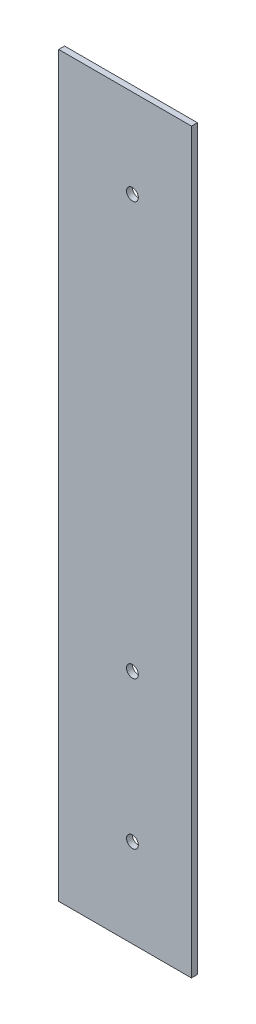
ISO-10303-21;
HEADER;
FILE_DESCRIPTION(('STEP AP214'),'2;1');
FILE_NAME('part.step','',(''),(''),'','','');
FILE_SCHEMA(('AUTOMOTIVE_DESIGN { 1 0 10303 214 1 1 1 1 }'));
ENDSEC;
DATA;
#1=APPLICATION_CONTEXT('core data for automotive mechanical design processes');
#2=APPLICATION_PROTOCOL_DEFINITION('international standard','automotive_design',2000,#1);
#3=PRODUCT_CONTEXT('',#1,'mechanical');
#4=PRODUCT('Part','Part','',(#3));
#5=PRODUCT_RELATED_PRODUCT_CATEGORY('part','',(#4));
#6=PRODUCT_DEFINITION_FORMATION('','',#4);
#7=PRODUCT_DEFINITION_CONTEXT('part definition',#1,'design');
#8=PRODUCT_DEFINITION('design','',#6,#7);
#9=PRODUCT_DEFINITION_SHAPE('','',#8);
#10=(LENGTH_UNIT() NAMED_UNIT(*) SI_UNIT(.MILLI.,.METRE.));
#11=(NAMED_UNIT(*) PLANE_ANGLE_UNIT() SI_UNIT($,.RADIAN.));
#12=(NAMED_UNIT(*) SI_UNIT($,.STERADIAN.) SOLID_ANGLE_UNIT());
#13=UNCERTAINTY_MEASURE_WITH_UNIT(LENGTH_MEASURE(1.E-05),#10,'distance_accuracy_value','');
#14=(GEOMETRIC_REPRESENTATION_CONTEXT(3) GLOBAL_UNCERTAINTY_ASSIGNED_CONTEXT((#13)) GLOBAL_UNIT_ASSIGNED_CONTEXT((#10,
#11,#12)) REPRESENTATION_CONTEXT('',''));
#15=CARTESIAN_POINT('',(0.,0.,0.));
#16=DIRECTION('',(0.,0.,1.));
#17=DIRECTION('',(1.,0.,0.));
#18=AXIS2_PLACEMENT_3D('',#15,#16,#17);
#19=CARTESIAN_POINT('',(22.5,99.9999999999999,2.));
#20=DIRECTION('',(-1.,0.,0.));
#21=DIRECTION('',(0.,-1.,0.));
#22=AXIS2_PLACEMENT_3D('',#19,#20,#21);
#23=PLANE('',#22);
#24=DIRECTION('',(0.,1.,0.));
#25=VECTOR('',#24,1.);
#26=CARTESIAN_POINT('',(22.5,99.9999999999999,0.));
#27=LINE('',#26,#25);
#28=CARTESIAN_POINT('',(22.5,-150.,0.));
#29=VERTEX_POINT('',#28);
#30=CARTESIAN_POINT('',(22.5,99.9999999999999,0.));
#31=VERTEX_POINT('',#30);
#32=EDGE_CURVE('E91',#29,#31,#27,.T.);
#33=ORIENTED_EDGE('',*,*,#32,.T.);
#34=DIRECTION('',(0.,0.,-1.));
#35=VECTOR('',#34,1.);
#36=CARTESIAN_POINT('',(22.5,99.9999999999999,2.));
#37=LINE('',#36,#35);
#38=CARTESIAN_POINT('',(22.5,99.9999999999999,2.));
#39=VERTEX_POINT('',#38);
#40=EDGE_CURVE('E11',#39,#31,#37,.T.);
#41=ORIENTED_EDGE('',*,*,#40,.F.);
#42=DIRECTION('',(0.,1.,0.));
#43=VECTOR('',#42,1.);
#44=CARTESIAN_POINT('',(22.5,99.9999999999999,2.));
#45=LINE('',#44,#43);
#46=CARTESIAN_POINT('',(22.5,-150.,2.));
#47=VERTEX_POINT('',#46);
#48=EDGE_CURVE('E85',#47,#39,#45,.T.);
#49=ORIENTED_EDGE('',*,*,#48,.F.);
#50=DIRECTION('',(0.,0.,1.));
#51=VECTOR('',#50,1.);
#52=CARTESIAN_POINT('',(22.5,-150.,2.));
#53=LINE('',#52,#51);
#54=EDGE_CURVE('E95',#29,#47,#53,.T.);
#55=ORIENTED_EDGE('',*,*,#54,.F.);
#56=EDGE_LOOP('',(#33,#41,#49,#55));
#57=FACE_BOUND('',#56,.T.);
#58=ADVANCED_FACE('F37',(#57),#23,.F.);
#59=CARTESIAN_POINT('',(-22.5,99.9999999999999,2.));
#60=DIRECTION('',(0.,-1.,0.));
#61=DIRECTION('',(0.,0.,-1.));
#62=AXIS2_PLACEMENT_3D('',#59,#60,#61);
#63=PLANE('',#62);
#64=DIRECTION('',(-1.,0.,0.));
#65=VECTOR('',#64,1.);
#66=CARTESIAN_POINT('',(-22.5,99.9999999999999,0.));
#67=LINE('',#66,#65);
#68=CARTESIAN_POINT('',(-22.5,99.9999999999999,0.));
#69=VERTEX_POINT('',#68);
#70=EDGE_CURVE('E64',#31,#69,#67,.T.);
#71=ORIENTED_EDGE('',*,*,#70,.T.);
#72=DIRECTION('',(0.,0.,-1.));
#73=VECTOR('',#72,1.);
#74=CARTESIAN_POINT('',(-22.5,99.9999999999999,2.));
#75=LINE('',#74,#73);
#76=CARTESIAN_POINT('',(-22.5,99.9999999999999,2.));
#77=VERTEX_POINT('',#76);
#78=EDGE_CURVE('E45',#77,#69,#75,.T.);
#79=ORIENTED_EDGE('',*,*,#78,.F.);
#80=DIRECTION('',(-1.,0.,0.));
#81=VECTOR('',#80,1.);
#82=CARTESIAN_POINT('',(-22.5,99.9999999999999,2.));
#83=LINE('',#82,#81);
#84=EDGE_CURVE('E53',#39,#77,#83,.T.);
#85=ORIENTED_EDGE('',*,*,#84,.F.);
#86=ORIENTED_EDGE('',*,*,#40,.T.);
#87=EDGE_LOOP('',(#71,#79,#85,#86));
#88=FACE_BOUND('',#87,.T.);
#89=ADVANCED_FACE('F125',(#88),#63,.F.);
#90=CARTESIAN_POINT('',(-22.5,99.9999999999999,2.));
#91=DIRECTION('',(1.,0.,0.));
#92=DIRECTION('',(0.,1.,0.));
#93=AXIS2_PLACEMENT_3D('',#90,#91,#92);
#94=PLANE('',#93);
#95=DIRECTION('',(0.,-1.,0.));
#96=VECTOR('',#95,1.);
#97=CARTESIAN_POINT('',(-22.5,99.9999999999999,0.));
#98=LINE('',#97,#96);
#99=CARTESIAN_POINT('',(-22.5,-150.,0.));
#100=VERTEX_POINT('',#99);
#101=EDGE_CURVE('E80',#69,#100,#98,.T.);
#102=ORIENTED_EDGE('',*,*,#101,.T.);
#103=DIRECTION('',(0.,0.,-1.));
#104=VECTOR('',#103,1.);
#105=CARTESIAN_POINT('',(-22.5,-150.,2.));
#106=LINE('',#105,#104);
#107=CARTESIAN_POINT('',(-22.5,-150.,2.));
#108=VERTEX_POINT('',#107);
#109=EDGE_CURVE('E84',#108,#100,#106,.T.);
#110=ORIENTED_EDGE('',*,*,#109,.F.);
#111=DIRECTION('',(0.,-1.,0.));
#112=VECTOR('',#111,1.);
#113=CARTESIAN_POINT('',(-22.5,99.9999999999999,2.));
#114=LINE('',#113,#112);
#115=EDGE_CURVE('E68',#77,#108,#114,.T.);
#116=ORIENTED_EDGE('',*,*,#115,.F.);
#117=ORIENTED_EDGE('',*,*,#78,.T.);
#118=EDGE_LOOP('',(#102,#110,#116,#117));
#119=FACE_BOUND('',#118,.T.);
#120=ADVANCED_FACE('F82',(#119),#94,.F.);
#121=CARTESIAN_POINT('',(0.,0.,2.));
#122=DIRECTION('',(0.,0.,1.));
#123=DIRECTION('',(1.,0.,0.));
#124=AXIS2_PLACEMENT_3D('',#121,#122,#123);
#125=PLANE('',#124);
#126=CARTESIAN_POINT('',(2.49999999999998,-120.,2.));
#127=DIRECTION('',(0.,0.,1.));
#128=DIRECTION('',(1.,0.,0.));
#129=AXIS2_PLACEMENT_3D('',#126,#127,#128);
#130=CIRCLE('',#129,2.);
#131=CARTESIAN_POINT('',(4.49999999999998,-120.,2.));
#132=VERTEX_POINT('',#131);
#133=EDGE_CURVE('E99',#132,#132,#130,.T.);
#134=ORIENTED_EDGE('',*,*,#133,.F.);
#135=EDGE_LOOP('',(#134));
#136=FACE_BOUND('',#135,.T.);
#137=CARTESIAN_POINT('',(2.49999999999998,70.,2.));
#138=DIRECTION('',(0.,0.,1.));
#139=DIRECTION('',(1.,0.,0.));
#140=AXIS2_PLACEMENT_3D('',#137,#138,#139);
#141=CIRCLE('',#140,2.);
#142=CARTESIAN_POINT('',(4.49999999999998,70.,2.));
#143=VERTEX_POINT('',#142);
#144=EDGE_CURVE('E112',#143,#143,#141,.T.);
#145=ORIENTED_EDGE('',*,*,#144,.F.);
#146=EDGE_LOOP('',(#145));
#147=FACE_BOUND('',#146,.T.);
#148=CARTESIAN_POINT('',(2.49999999999998,-70.0000000000001,2.));
#149=DIRECTION('',(0.,0.,1.));
#150=DIRECTION('',(1.,0.,0.));
#151=AXIS2_PLACEMENT_3D('',#148,#149,#150);
#152=CIRCLE('',#151,2.);
#153=CARTESIAN_POINT('',(4.49999999999998,-70.0000000000001,2.));
#154=VERTEX_POINT('',#153);
#155=EDGE_CURVE('E108',#154,#154,#152,.T.);
#156=ORIENTED_EDGE('',*,*,#155,.F.);
#157=EDGE_LOOP('',(#156));
#158=FACE_BOUND('',#157,.T.);
#159=ORIENTED_EDGE('',*,*,#48,.T.);
#160=ORIENTED_EDGE('',*,*,#84,.T.);
#161=ORIENTED_EDGE('',*,*,#115,.T.);
#162=DIRECTION('',(-1.,0.,0.));
#163=VECTOR('',#162,1.);
#164=CARTESIAN_POINT('',(-22.5,-150.,2.));
#165=LINE('',#164,#163);
#166=EDGE_CURVE('E98',#47,#108,#165,.T.);
#167=ORIENTED_EDGE('',*,*,#166,.F.);
#168=EDGE_LOOP('',(#159,#160,#161,#167));
#169=FACE_BOUND('',#168,.T.);
#170=ADVANCED_FACE('F128',(#136,#147,#158,#169),#125,.T.);
#171=CARTESIAN_POINT('',(0.,0.,0.));
#172=DIRECTION('',(0.,0.,1.));
#173=DIRECTION('',(1.,0.,0.));
#174=AXIS2_PLACEMENT_3D('',#171,#172,#173);
#175=PLANE('',#174);
#176=CARTESIAN_POINT('',(2.49999999999998,-120.,0.));
#177=DIRECTION('',(0.,0.,-1.));
#178=DIRECTION('',(-1.,0.,0.));
#179=AXIS2_PLACEMENT_3D('',#176,#177,#178);
#180=CIRCLE('',#179,2.);
#181=CARTESIAN_POINT('',(0.49999999999998,-120.,0.));
#182=VERTEX_POINT('',#181);
#183=EDGE_CURVE('E102',#182,#182,#180,.T.);
#184=ORIENTED_EDGE('',*,*,#183,.F.);
#185=EDGE_LOOP('',(#184));
#186=FACE_BOUND('',#185,.T.);
#187=CARTESIAN_POINT('',(2.49999999999998,70.,0.));
#188=DIRECTION('',(0.,0.,1.));
#189=DIRECTION('',(1.,0.,0.));
#190=AXIS2_PLACEMENT_3D('',#187,#188,#189);
#191=CIRCLE('',#190,2.);
#192=CARTESIAN_POINT('',(4.49999999999998,70.,0.));
#193=VERTEX_POINT('',#192);
#194=EDGE_CURVE('E109',#193,#193,#191,.T.);
#195=ORIENTED_EDGE('',*,*,#194,.T.);
#196=EDGE_LOOP('',(#195));
#197=FACE_BOUND('',#196,.T.);
#198=CARTESIAN_POINT('',(2.49999999999998,-70.0000000000001,0.));
#199=DIRECTION('',(0.,0.,1.));
#200=DIRECTION('',(1.,0.,0.));
#201=AXIS2_PLACEMENT_3D('',#198,#199,#200);
#202=CIRCLE('',#201,2.);
#203=CARTESIAN_POINT('',(4.49999999999998,-70.0000000000001,0.));
#204=VERTEX_POINT('',#203);
#205=EDGE_CURVE('E115',#204,#204,#202,.T.);
#206=ORIENTED_EDGE('',*,*,#205,.T.);
#207=EDGE_LOOP('',(#206));
#208=FACE_BOUND('',#207,.T.);
#209=ORIENTED_EDGE('',*,*,#32,.F.);
#210=DIRECTION('',(1.,0.,0.));
#211=VECTOR('',#210,1.);
#212=CARTESIAN_POINT('',(-22.5,-150.,0.));
#213=LINE('',#212,#211);
#214=EDGE_CURVE('E88',#100,#29,#213,.T.);
#215=ORIENTED_EDGE('',*,*,#214,.F.);
#216=ORIENTED_EDGE('',*,*,#101,.F.);
#217=ORIENTED_EDGE('',*,*,#70,.F.);
#218=EDGE_LOOP('',(#209,#215,#216,#217));
#219=FACE_BOUND('',#218,.T.);
#220=ADVANCED_FACE('F89',(#186,#197,#208,#219),#175,.F.);
#221=CARTESIAN_POINT('',(2.49999999999998,-70.0000000000001,0.));
#222=DIRECTION('',(0.,0.,1.));
#223=DIRECTION('',(1.,0.,0.));
#224=AXIS2_PLACEMENT_3D('',#221,#222,#223);
#225=CYLINDRICAL_SURFACE('',#224,2.);
#226=ORIENTED_EDGE('',*,*,#205,.F.);
#227=EDGE_LOOP('',(#226));
#228=FACE_BOUND('',#227,.T.);
#229=ORIENTED_EDGE('',*,*,#155,.T.);
#230=EDGE_LOOP('',(#229));
#231=FACE_BOUND('',#230,.T.);
#232=ADVANCED_FACE('F136',(#228,#231),#225,.F.);
#233=CARTESIAN_POINT('',(2.49999999999998,70.,0.));
#234=DIRECTION('',(0.,0.,1.));
#235=DIRECTION('',(1.,0.,0.));
#236=AXIS2_PLACEMENT_3D('',#233,#234,#235);
#237=CYLINDRICAL_SURFACE('',#236,2.);
#238=ORIENTED_EDGE('',*,*,#194,.F.);
#239=EDGE_LOOP('',(#238));
#240=FACE_BOUND('',#239,.T.);
#241=ORIENTED_EDGE('',*,*,#144,.T.);
#242=EDGE_LOOP('',(#241));
#243=FACE_BOUND('',#242,.T.);
#244=ADVANCED_FACE('F168',(#240,#243),#237,.F.);
#245=CARTESIAN_POINT('',(0.,-150.,0.));
#246=DIRECTION('',(0.,-1.,0.));
#247=DIRECTION('',(0.,0.,-1.));
#248=AXIS2_PLACEMENT_3D('',#245,#246,#247);
#249=PLANE('',#248);
#250=ORIENTED_EDGE('',*,*,#109,.T.);
#251=ORIENTED_EDGE('',*,*,#214,.T.);
#252=ORIENTED_EDGE('',*,*,#54,.T.);
#253=ORIENTED_EDGE('',*,*,#166,.T.);
#254=EDGE_LOOP('',(#250,#251,#252,#253));
#255=FACE_BOUND('',#254,.T.);
#256=ADVANCED_FACE('F97',(#255),#249,.T.);
#257=CARTESIAN_POINT('',(2.49999999999998,-120.,50.));
#258=DIRECTION('',(0.,0.,-1.));
#259=DIRECTION('',(-1.,0.,0.));
#260=AXIS2_PLACEMENT_3D('',#257,#258,#259);
#261=CYLINDRICAL_SURFACE('',#260,2.);
#262=ORIENTED_EDGE('',*,*,#133,.T.);
#263=EDGE_LOOP('',(#262));
#264=FACE_BOUND('',#263,.T.);
#265=ORIENTED_EDGE('',*,*,#183,.T.);
#266=EDGE_LOOP('',(#265));
#267=FACE_BOUND('',#266,.T.);
#268=ADVANCED_FACE('F167',(#264,#267),#261,.F.);
#269=CLOSED_SHELL('',(#58,#89,#120,#170,#220,#232,#244,#256,#268));
#270=MANIFOLD_SOLID_BREP('B2',#269);
#271=ADVANCED_BREP_SHAPE_REPRESENTATION('',(#18,#270),#14);
#272=SHAPE_DEFINITION_REPRESENTATION(#9,#271);
ENDSEC;
END-ISO-10303-21;
